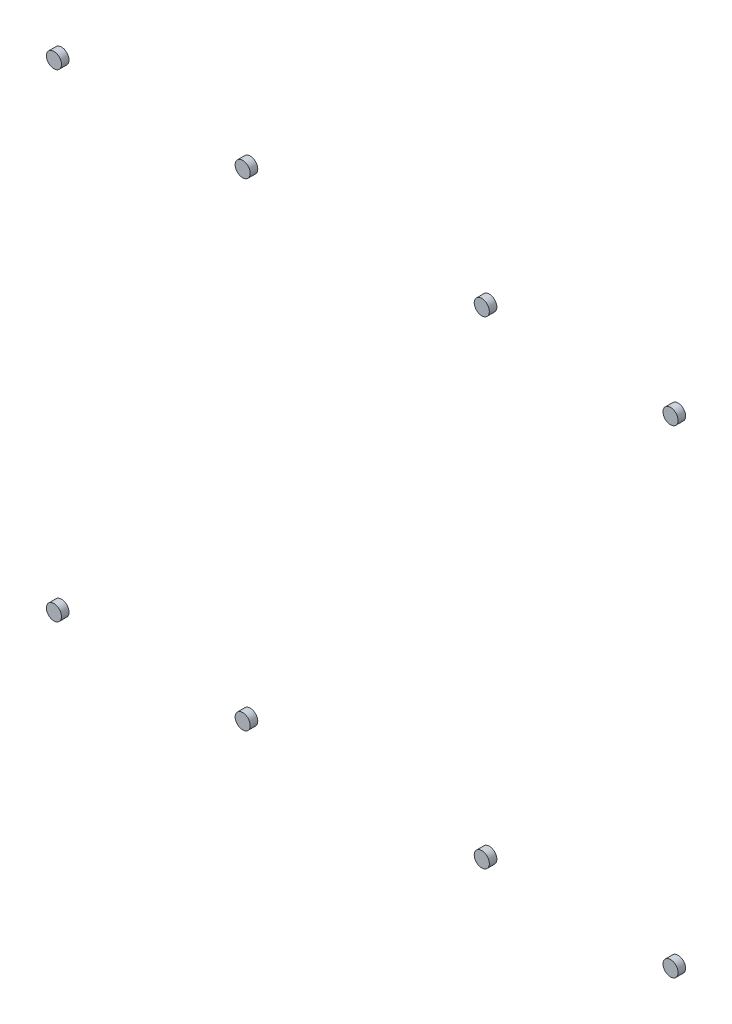
ISO-10303-21;
HEADER;
FILE_DESCRIPTION(('STEP AP214'),'2;1');
FILE_NAME('part.step','',(''),(''),'','','');
FILE_SCHEMA(('AUTOMOTIVE_DESIGN { 1 0 10303 214 1 1 1 1 }'));
ENDSEC;
DATA;
#1=APPLICATION_CONTEXT('core data for automotive mechanical design processes');
#2=APPLICATION_PROTOCOL_DEFINITION('international standard','automotive_design',2000,#1);
#3=PRODUCT_CONTEXT('',#1,'mechanical');
#4=PRODUCT('Part','Part','',(#3));
#5=PRODUCT_RELATED_PRODUCT_CATEGORY('part','',(#4));
#6=PRODUCT_DEFINITION_FORMATION('','',#4);
#7=PRODUCT_DEFINITION_CONTEXT('part definition',#1,'design');
#8=PRODUCT_DEFINITION('design','',#6,#7);
#9=PRODUCT_DEFINITION_SHAPE('','',#8);
#10=(LENGTH_UNIT() NAMED_UNIT(*) SI_UNIT(.MILLI.,.METRE.));
#11=(NAMED_UNIT(*) PLANE_ANGLE_UNIT() SI_UNIT($,.RADIAN.));
#12=(NAMED_UNIT(*) SI_UNIT($,.STERADIAN.) SOLID_ANGLE_UNIT());
#13=UNCERTAINTY_MEASURE_WITH_UNIT(LENGTH_MEASURE(1.E-05),#10,'distance_accuracy_value','');
#14=(GEOMETRIC_REPRESENTATION_CONTEXT(3) GLOBAL_UNCERTAINTY_ASSIGNED_CONTEXT((#13)) GLOBAL_UNIT_ASSIGNED_CONTEXT((#10,
#11,#12)) REPRESENTATION_CONTEXT('',''));
#15=CARTESIAN_POINT('',(0.,0.,0.));
#16=DIRECTION('',(0.,0.,1.));
#17=DIRECTION('',(1.,0.,0.));
#18=AXIS2_PLACEMENT_3D('',#15,#16,#17);
#19=CARTESIAN_POINT('',(-245.,-190.,6.));
#20=DIRECTION('',(0.,0.,1.));
#21=DIRECTION('',(1.,0.,0.));
#22=AXIS2_PLACEMENT_3D('',#19,#20,#21);
#23=PLANE('',#22);
#24=CARTESIAN_POINT('',(-245.,-190.,6.));
#25=DIRECTION('',(0.,0.,-1.));
#26=DIRECTION('',(-1.,0.,0.));
#27=AXIS2_PLACEMENT_3D('',#24,#25,#26);
#28=CIRCLE('',#27,6.);
#29=CARTESIAN_POINT('',(-251.,-190.,6.));
#30=VERTEX_POINT('',#29);
#31=EDGE_CURVE('P0_E10',#30,#30,#28,.T.);
#32=ORIENTED_EDGE('',*,*,#31,.F.);
#33=EDGE_LOOP('',(#32));
#34=FACE_BOUND('',#33,.T.);
#35=ADVANCED_FACE('P0_F15',(#34),#23,.T.);
#36=CARTESIAN_POINT('',(-245.,-190.,0.));
#37=DIRECTION('',(0.,0.,-1.));
#38=DIRECTION('',(-1.,0.,0.));
#39=AXIS2_PLACEMENT_3D('',#36,#37,#38);
#40=PLANE('',#39);
#41=CARTESIAN_POINT('',(-245.,-190.,0.));
#42=DIRECTION('',(0.,0.,1.));
#43=DIRECTION('',(1.,0.,0.));
#44=AXIS2_PLACEMENT_3D('',#41,#42,#43);
#45=CIRCLE('',#44,6.);
#46=CARTESIAN_POINT('',(-239.,-190.,0.));
#47=VERTEX_POINT('',#46);
#48=EDGE_CURVE('P0_E22',#47,#47,#45,.T.);
#49=ORIENTED_EDGE('',*,*,#48,.F.);
#50=EDGE_LOOP('',(#49));
#51=FACE_BOUND('',#50,.T.);
#52=ADVANCED_FACE('P0_F29',(#51),#40,.T.);
#53=CARTESIAN_POINT('',(-245.,-190.,0.));
#54=DIRECTION('',(0.,0.,1.));
#55=DIRECTION('',(1.,0.,0.));
#56=AXIS2_PLACEMENT_3D('',#53,#54,#55);
#57=CYLINDRICAL_SURFACE('',#56,6.);
#58=ORIENTED_EDGE('',*,*,#31,.T.);
#59=EDGE_LOOP('',(#58));
#60=FACE_BOUND('',#59,.T.);
#61=ORIENTED_EDGE('',*,*,#48,.T.);
#62=EDGE_LOOP('',(#61));
#63=FACE_BOUND('',#62,.T.);
#64=ADVANCED_FACE('P0_F17',(#60,#63),#57,.T.);
#65=CLOSED_SHELL('',(#35,#52,#64));
#66=MANIFOLD_SOLID_BREP('P0_B1',#65);
#67=CARTESIAN_POINT('',(-95.,-190.,6.));
#68=DIRECTION('',(0.,0.,1.));
#69=DIRECTION('',(1.,0.,0.));
#70=AXIS2_PLACEMENT_3D('',#67,#68,#69);
#71=PLANE('',#70);
#72=CARTESIAN_POINT('',(-95.,-190.,6.));
#73=DIRECTION('',(0.,0.,-1.));
#74=DIRECTION('',(-1.,0.,0.));
#75=AXIS2_PLACEMENT_3D('',#72,#73,#74);
#76=CIRCLE('',#75,6.);
#77=CARTESIAN_POINT('',(-101.,-190.,6.));
#78=VERTEX_POINT('',#77);
#79=EDGE_CURVE('P1_E10',#78,#78,#76,.T.);
#80=ORIENTED_EDGE('',*,*,#79,.F.);
#81=EDGE_LOOP('',(#80));
#82=FACE_BOUND('',#81,.T.);
#83=ADVANCED_FACE('P1_F15',(#82),#71,.T.);
#84=CARTESIAN_POINT('',(-95.,-190.,0.));
#85=DIRECTION('',(0.,0.,-1.));
#86=DIRECTION('',(-1.,0.,0.));
#87=AXIS2_PLACEMENT_3D('',#84,#85,#86);
#88=PLANE('',#87);
#89=CARTESIAN_POINT('',(-95.,-190.,0.));
#90=DIRECTION('',(0.,0.,1.));
#91=DIRECTION('',(1.,0.,0.));
#92=AXIS2_PLACEMENT_3D('',#89,#90,#91);
#93=CIRCLE('',#92,6.);
#94=CARTESIAN_POINT('',(-89.,-190.,0.));
#95=VERTEX_POINT('',#94);
#96=EDGE_CURVE('P1_E22',#95,#95,#93,.T.);
#97=ORIENTED_EDGE('',*,*,#96,.F.);
#98=EDGE_LOOP('',(#97));
#99=FACE_BOUND('',#98,.T.);
#100=ADVANCED_FACE('P1_F29',(#99),#88,.T.);
#101=CARTESIAN_POINT('',(-95.,-190.,0.));
#102=DIRECTION('',(0.,0.,1.));
#103=DIRECTION('',(1.,0.,0.));
#104=AXIS2_PLACEMENT_3D('',#101,#102,#103);
#105=CYLINDRICAL_SURFACE('',#104,6.);
#106=ORIENTED_EDGE('',*,*,#79,.T.);
#107=EDGE_LOOP('',(#106));
#108=FACE_BOUND('',#107,.T.);
#109=ORIENTED_EDGE('',*,*,#96,.T.);
#110=EDGE_LOOP('',(#109));
#111=FACE_BOUND('',#110,.T.);
#112=ADVANCED_FACE('P1_F17',(#108,#111),#105,.T.);
#113=CLOSED_SHELL('',(#83,#100,#112));
#114=MANIFOLD_SOLID_BREP('P1_B1',#113);
#115=CARTESIAN_POINT('',(245.,-190.,6.));
#116=DIRECTION('',(0.,0.,1.));
#117=DIRECTION('',(1.,0.,0.));
#118=AXIS2_PLACEMENT_3D('',#115,#116,#117);
#119=PLANE('',#118);
#120=CARTESIAN_POINT('',(245.,-190.,6.));
#121=DIRECTION('',(0.,0.,-1.));
#122=DIRECTION('',(-1.,0.,0.));
#123=AXIS2_PLACEMENT_3D('',#120,#121,#122);
#124=CIRCLE('',#123,6.);
#125=CARTESIAN_POINT('',(239.,-190.,6.));
#126=VERTEX_POINT('',#125);
#127=EDGE_CURVE('P2_E10',#126,#126,#124,.T.);
#128=ORIENTED_EDGE('',*,*,#127,.F.);
#129=EDGE_LOOP('',(#128));
#130=FACE_BOUND('',#129,.T.);
#131=ADVANCED_FACE('P2_F15',(#130),#119,.T.);
#132=CARTESIAN_POINT('',(245.,-190.,0.));
#133=DIRECTION('',(0.,0.,-1.));
#134=DIRECTION('',(-1.,0.,0.));
#135=AXIS2_PLACEMENT_3D('',#132,#133,#134);
#136=PLANE('',#135);
#137=CARTESIAN_POINT('',(245.,-190.,0.));
#138=DIRECTION('',(0.,0.,1.));
#139=DIRECTION('',(1.,0.,0.));
#140=AXIS2_PLACEMENT_3D('',#137,#138,#139);
#141=CIRCLE('',#140,6.);
#142=CARTESIAN_POINT('',(251.,-190.,0.));
#143=VERTEX_POINT('',#142);
#144=EDGE_CURVE('P2_E22',#143,#143,#141,.T.);
#145=ORIENTED_EDGE('',*,*,#144,.F.);
#146=EDGE_LOOP('',(#145));
#147=FACE_BOUND('',#146,.T.);
#148=ADVANCED_FACE('P2_F29',(#147),#136,.T.);
#149=CARTESIAN_POINT('',(245.,-190.,0.));
#150=DIRECTION('',(0.,0.,1.));
#151=DIRECTION('',(1.,0.,0.));
#152=AXIS2_PLACEMENT_3D('',#149,#150,#151);
#153=CYLINDRICAL_SURFACE('',#152,6.);
#154=ORIENTED_EDGE('',*,*,#127,.T.);
#155=EDGE_LOOP('',(#154));
#156=FACE_BOUND('',#155,.T.);
#157=ORIENTED_EDGE('',*,*,#144,.T.);
#158=EDGE_LOOP('',(#157));
#159=FACE_BOUND('',#158,.T.);
#160=ADVANCED_FACE('P2_F17',(#156,#159),#153,.T.);
#161=CLOSED_SHELL('',(#131,#148,#160));
#162=MANIFOLD_SOLID_BREP('P2_B1',#161);
#163=CARTESIAN_POINT('',(95.,-190.,6.));
#164=DIRECTION('',(0.,0.,1.));
#165=DIRECTION('',(1.,0.,0.));
#166=AXIS2_PLACEMENT_3D('',#163,#164,#165);
#167=PLANE('',#166);
#168=CARTESIAN_POINT('',(95.,-190.,6.));
#169=DIRECTION('',(0.,0.,-1.));
#170=DIRECTION('',(-1.,0.,0.));
#171=AXIS2_PLACEMENT_3D('',#168,#169,#170);
#172=CIRCLE('',#171,6.);
#173=CARTESIAN_POINT('',(89.,-190.,6.));
#174=VERTEX_POINT('',#173);
#175=EDGE_CURVE('P3_E10',#174,#174,#172,.T.);
#176=ORIENTED_EDGE('',*,*,#175,.F.);
#177=EDGE_LOOP('',(#176));
#178=FACE_BOUND('',#177,.T.);
#179=ADVANCED_FACE('P3_F15',(#178),#167,.T.);
#180=CARTESIAN_POINT('',(95.,-190.,0.));
#181=DIRECTION('',(0.,0.,-1.));
#182=DIRECTION('',(-1.,0.,0.));
#183=AXIS2_PLACEMENT_3D('',#180,#181,#182);
#184=PLANE('',#183);
#185=CARTESIAN_POINT('',(95.,-190.,0.));
#186=DIRECTION('',(0.,0.,1.));
#187=DIRECTION('',(1.,0.,0.));
#188=AXIS2_PLACEMENT_3D('',#185,#186,#187);
#189=CIRCLE('',#188,6.);
#190=CARTESIAN_POINT('',(101.,-190.,0.));
#191=VERTEX_POINT('',#190);
#192=EDGE_CURVE('P3_E22',#191,#191,#189,.T.);
#193=ORIENTED_EDGE('',*,*,#192,.F.);
#194=EDGE_LOOP('',(#193));
#195=FACE_BOUND('',#194,.T.);
#196=ADVANCED_FACE('P3_F29',(#195),#184,.T.);
#197=CARTESIAN_POINT('',(95.,-190.,0.));
#198=DIRECTION('',(0.,0.,1.));
#199=DIRECTION('',(1.,0.,0.));
#200=AXIS2_PLACEMENT_3D('',#197,#198,#199);
#201=CYLINDRICAL_SURFACE('',#200,6.);
#202=ORIENTED_EDGE('',*,*,#175,.T.);
#203=EDGE_LOOP('',(#202));
#204=FACE_BOUND('',#203,.T.);
#205=ORIENTED_EDGE('',*,*,#192,.T.);
#206=EDGE_LOOP('',(#205));
#207=FACE_BOUND('',#206,.T.);
#208=ADVANCED_FACE('P3_F17',(#204,#207),#201,.T.);
#209=CLOSED_SHELL('',(#179,#196,#208));
#210=MANIFOLD_SOLID_BREP('P3_B1',#209);
#211=CARTESIAN_POINT('',(-245.,190.,6.));
#212=DIRECTION('',(0.,0.,1.));
#213=DIRECTION('',(1.,0.,0.));
#214=AXIS2_PLACEMENT_3D('',#211,#212,#213);
#215=PLANE('',#214);
#216=CARTESIAN_POINT('',(-245.,190.,6.));
#217=DIRECTION('',(0.,0.,-1.));
#218=DIRECTION('',(-1.,0.,0.));
#219=AXIS2_PLACEMENT_3D('',#216,#217,#218);
#220=CIRCLE('',#219,6.);
#221=CARTESIAN_POINT('',(-251.,190.,6.));
#222=VERTEX_POINT('',#221);
#223=EDGE_CURVE('P4_E10',#222,#222,#220,.T.);
#224=ORIENTED_EDGE('',*,*,#223,.F.);
#225=EDGE_LOOP('',(#224));
#226=FACE_BOUND('',#225,.T.);
#227=ADVANCED_FACE('P4_F15',(#226),#215,.T.);
#228=CARTESIAN_POINT('',(-245.,190.,0.));
#229=DIRECTION('',(0.,0.,-1.));
#230=DIRECTION('',(-1.,0.,0.));
#231=AXIS2_PLACEMENT_3D('',#228,#229,#230);
#232=PLANE('',#231);
#233=CARTESIAN_POINT('',(-245.,190.,0.));
#234=DIRECTION('',(0.,0.,1.));
#235=DIRECTION('',(1.,0.,0.));
#236=AXIS2_PLACEMENT_3D('',#233,#234,#235);
#237=CIRCLE('',#236,6.);
#238=CARTESIAN_POINT('',(-239.,190.,0.));
#239=VERTEX_POINT('',#238);
#240=EDGE_CURVE('P4_E22',#239,#239,#237,.T.);
#241=ORIENTED_EDGE('',*,*,#240,.F.);
#242=EDGE_LOOP('',(#241));
#243=FACE_BOUND('',#242,.T.);
#244=ADVANCED_FACE('P4_F29',(#243),#232,.T.);
#245=CARTESIAN_POINT('',(-245.,190.,0.));
#246=DIRECTION('',(0.,0.,1.));
#247=DIRECTION('',(1.,0.,0.));
#248=AXIS2_PLACEMENT_3D('',#245,#246,#247);
#249=CYLINDRICAL_SURFACE('',#248,6.);
#250=ORIENTED_EDGE('',*,*,#223,.T.);
#251=EDGE_LOOP('',(#250));
#252=FACE_BOUND('',#251,.T.);
#253=ORIENTED_EDGE('',*,*,#240,.T.);
#254=EDGE_LOOP('',(#253));
#255=FACE_BOUND('',#254,.T.);
#256=ADVANCED_FACE('P4_F17',(#252,#255),#249,.T.);
#257=CLOSED_SHELL('',(#227,#244,#256));
#258=MANIFOLD_SOLID_BREP('P4_B1',#257);
#259=CARTESIAN_POINT('',(-95.,190.,6.));
#260=DIRECTION('',(0.,0.,1.));
#261=DIRECTION('',(1.,0.,0.));
#262=AXIS2_PLACEMENT_3D('',#259,#260,#261);
#263=PLANE('',#262);
#264=CARTESIAN_POINT('',(-95.,190.,6.));
#265=DIRECTION('',(0.,0.,-1.));
#266=DIRECTION('',(-1.,0.,0.));
#267=AXIS2_PLACEMENT_3D('',#264,#265,#266);
#268=CIRCLE('',#267,6.);
#269=CARTESIAN_POINT('',(-101.,190.,6.));
#270=VERTEX_POINT('',#269);
#271=EDGE_CURVE('P5_E10',#270,#270,#268,.T.);
#272=ORIENTED_EDGE('',*,*,#271,.F.);
#273=EDGE_LOOP('',(#272));
#274=FACE_BOUND('',#273,.T.);
#275=ADVANCED_FACE('P5_F15',(#274),#263,.T.);
#276=CARTESIAN_POINT('',(-95.,190.,0.));
#277=DIRECTION('',(0.,0.,-1.));
#278=DIRECTION('',(-1.,0.,0.));
#279=AXIS2_PLACEMENT_3D('',#276,#277,#278);
#280=PLANE('',#279);
#281=CARTESIAN_POINT('',(-95.,190.,0.));
#282=DIRECTION('',(0.,0.,1.));
#283=DIRECTION('',(1.,0.,0.));
#284=AXIS2_PLACEMENT_3D('',#281,#282,#283);
#285=CIRCLE('',#284,6.);
#286=CARTESIAN_POINT('',(-89.,190.,0.));
#287=VERTEX_POINT('',#286);
#288=EDGE_CURVE('P5_E22',#287,#287,#285,.T.);
#289=ORIENTED_EDGE('',*,*,#288,.F.);
#290=EDGE_LOOP('',(#289));
#291=FACE_BOUND('',#290,.T.);
#292=ADVANCED_FACE('P5_F29',(#291),#280,.T.);
#293=CARTESIAN_POINT('',(-95.,190.,0.));
#294=DIRECTION('',(0.,0.,1.));
#295=DIRECTION('',(1.,0.,0.));
#296=AXIS2_PLACEMENT_3D('',#293,#294,#295);
#297=CYLINDRICAL_SURFACE('',#296,6.);
#298=ORIENTED_EDGE('',*,*,#271,.T.);
#299=EDGE_LOOP('',(#298));
#300=FACE_BOUND('',#299,.T.);
#301=ORIENTED_EDGE('',*,*,#288,.T.);
#302=EDGE_LOOP('',(#301));
#303=FACE_BOUND('',#302,.T.);
#304=ADVANCED_FACE('P5_F17',(#300,#303),#297,.T.);
#305=CLOSED_SHELL('',(#275,#292,#304));
#306=MANIFOLD_SOLID_BREP('P5_B1',#305);
#307=CARTESIAN_POINT('',(95.,190.,6.));
#308=DIRECTION('',(0.,0.,1.));
#309=DIRECTION('',(1.,0.,0.));
#310=AXIS2_PLACEMENT_3D('',#307,#308,#309);
#311=PLANE('',#310);
#312=CARTESIAN_POINT('',(95.,190.,6.));
#313=DIRECTION('',(0.,0.,-1.));
#314=DIRECTION('',(-1.,0.,0.));
#315=AXIS2_PLACEMENT_3D('',#312,#313,#314);
#316=CIRCLE('',#315,6.);
#317=CARTESIAN_POINT('',(89.,190.,6.));
#318=VERTEX_POINT('',#317);
#319=EDGE_CURVE('P6_E10',#318,#318,#316,.T.);
#320=ORIENTED_EDGE('',*,*,#319,.F.);
#321=EDGE_LOOP('',(#320));
#322=FACE_BOUND('',#321,.T.);
#323=ADVANCED_FACE('P6_F15',(#322),#311,.T.);
#324=CARTESIAN_POINT('',(95.,190.,0.));
#325=DIRECTION('',(0.,0.,-1.));
#326=DIRECTION('',(-1.,0.,0.));
#327=AXIS2_PLACEMENT_3D('',#324,#325,#326);
#328=PLANE('',#327);
#329=CARTESIAN_POINT('',(95.,190.,0.));
#330=DIRECTION('',(0.,0.,1.));
#331=DIRECTION('',(1.,0.,0.));
#332=AXIS2_PLACEMENT_3D('',#329,#330,#331);
#333=CIRCLE('',#332,6.);
#334=CARTESIAN_POINT('',(101.,190.,0.));
#335=VERTEX_POINT('',#334);
#336=EDGE_CURVE('P6_E22',#335,#335,#333,.T.);
#337=ORIENTED_EDGE('',*,*,#336,.F.);
#338=EDGE_LOOP('',(#337));
#339=FACE_BOUND('',#338,.T.);
#340=ADVANCED_FACE('P6_F29',(#339),#328,.T.);
#341=CARTESIAN_POINT('',(95.,190.,0.));
#342=DIRECTION('',(0.,0.,1.));
#343=DIRECTION('',(1.,0.,0.));
#344=AXIS2_PLACEMENT_3D('',#341,#342,#343);
#345=CYLINDRICAL_SURFACE('',#344,6.);
#346=ORIENTED_EDGE('',*,*,#319,.T.);
#347=EDGE_LOOP('',(#346));
#348=FACE_BOUND('',#347,.T.);
#349=ORIENTED_EDGE('',*,*,#336,.T.);
#350=EDGE_LOOP('',(#349));
#351=FACE_BOUND('',#350,.T.);
#352=ADVANCED_FACE('P6_F17',(#348,#351),#345,.T.);
#353=CLOSED_SHELL('',(#323,#340,#352));
#354=MANIFOLD_SOLID_BREP('P6_B1',#353);
#355=CARTESIAN_POINT('',(245.,190.,6.));
#356=DIRECTION('',(0.,0.,1.));
#357=DIRECTION('',(1.,0.,0.));
#358=AXIS2_PLACEMENT_3D('',#355,#356,#357);
#359=PLANE('',#358);
#360=CARTESIAN_POINT('',(245.,190.,6.));
#361=DIRECTION('',(0.,0.,-1.));
#362=DIRECTION('',(-1.,0.,0.));
#363=AXIS2_PLACEMENT_3D('',#360,#361,#362);
#364=CIRCLE('',#363,6.);
#365=CARTESIAN_POINT('',(239.,190.,6.));
#366=VERTEX_POINT('',#365);
#367=EDGE_CURVE('P7_E9',#366,#366,#364,.T.);
#368=ORIENTED_EDGE('',*,*,#367,.F.);
#369=EDGE_LOOP('',(#368));
#370=FACE_BOUND('',#369,.T.);
#371=ADVANCED_FACE('P7_F14',(#370),#359,.T.);
#372=CARTESIAN_POINT('',(245.,190.,0.));
#373=DIRECTION('',(0.,0.,-1.));
#374=DIRECTION('',(-1.,0.,0.));
#375=AXIS2_PLACEMENT_3D('',#372,#373,#374);
#376=PLANE('',#375);
#377=CARTESIAN_POINT('',(245.,190.,0.));
#378=DIRECTION('',(0.,0.,1.));
#379=DIRECTION('',(1.,0.,0.));
#380=AXIS2_PLACEMENT_3D('',#377,#378,#379);
#381=CIRCLE('',#380,6.);
#382=CARTESIAN_POINT('',(251.,190.,0.));
#383=VERTEX_POINT('',#382);
#384=EDGE_CURVE('P7_E21',#383,#383,#381,.T.);
#385=ORIENTED_EDGE('',*,*,#384,.F.);
#386=EDGE_LOOP('',(#385));
#387=FACE_BOUND('',#386,.T.);
#388=ADVANCED_FACE('P7_F28',(#387),#376,.T.);
#389=CARTESIAN_POINT('',(245.,190.,0.));
#390=DIRECTION('',(0.,0.,1.));
#391=DIRECTION('',(1.,0.,0.));
#392=AXIS2_PLACEMENT_3D('',#389,#390,#391);
#393=CYLINDRICAL_SURFACE('',#392,6.);
#394=ORIENTED_EDGE('',*,*,#367,.T.);
#395=EDGE_LOOP('',(#394));
#396=FACE_BOUND('',#395,.T.);
#397=ORIENTED_EDGE('',*,*,#384,.T.);
#398=EDGE_LOOP('',(#397));
#399=FACE_BOUND('',#398,.T.);
#400=ADVANCED_FACE('P7_F16',(#396,#399),#393,.T.);
#401=CLOSED_SHELL('',(#371,#388,#400));
#402=MANIFOLD_SOLID_BREP('P7_B1',#401);
#403=ADVANCED_BREP_SHAPE_REPRESENTATION('',(#18,#66,#114,#162,#210,#258,#306,#354,#402),#14);
#404=SHAPE_DEFINITION_REPRESENTATION(#9,#403);
ENDSEC;
END-ISO-10303-21;
